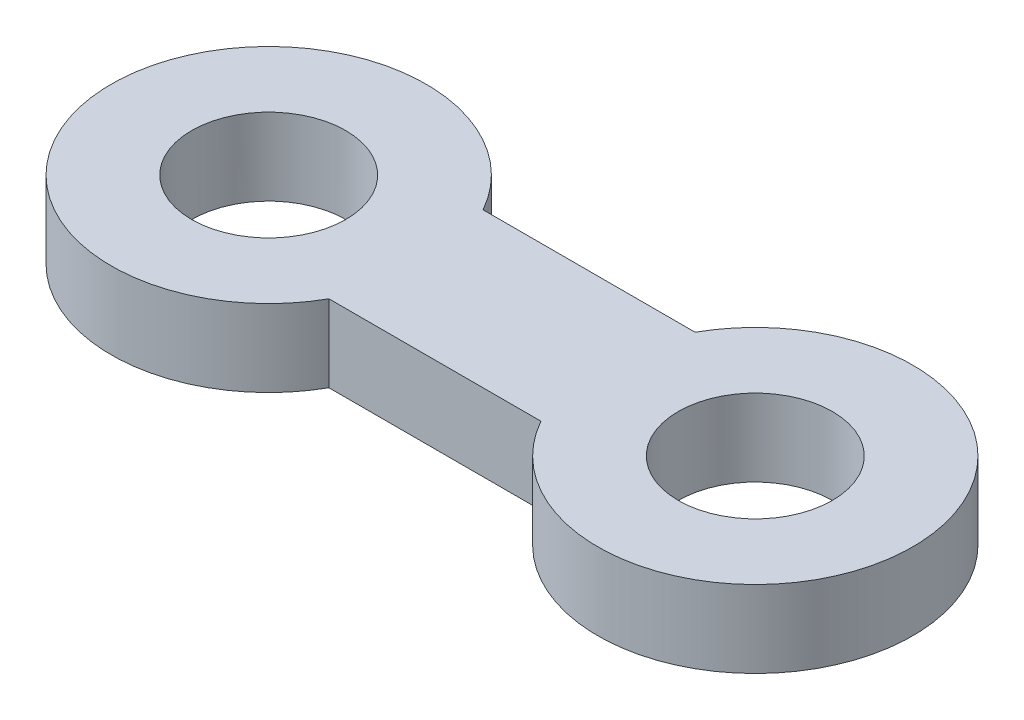
ISO-10303-21;
HEADER;
FILE_DESCRIPTION(('STEP AP214'),'2;1');
FILE_NAME('part.step','',(''),(''),'','','');
FILE_SCHEMA(('AUTOMOTIVE_DESIGN { 1 0 10303 214 1 1 1 1 }'));
ENDSEC;
DATA;
#1=APPLICATION_CONTEXT('core data for automotive mechanical design processes');
#2=APPLICATION_PROTOCOL_DEFINITION('international standard','automotive_design',2000,#1);
#3=PRODUCT_CONTEXT('',#1,'mechanical');
#4=PRODUCT('Part','Part','',(#3));
#5=PRODUCT_RELATED_PRODUCT_CATEGORY('part','',(#4));
#6=PRODUCT_DEFINITION_FORMATION('','',#4);
#7=PRODUCT_DEFINITION_CONTEXT('part definition',#1,'design');
#8=PRODUCT_DEFINITION('design','',#6,#7);
#9=PRODUCT_DEFINITION_SHAPE('','',#8);
#10=(LENGTH_UNIT() NAMED_UNIT(*) SI_UNIT(.MILLI.,.METRE.));
#11=(NAMED_UNIT(*) PLANE_ANGLE_UNIT() SI_UNIT($,.RADIAN.));
#12=(NAMED_UNIT(*) SI_UNIT($,.STERADIAN.) SOLID_ANGLE_UNIT());
#13=UNCERTAINTY_MEASURE_WITH_UNIT(LENGTH_MEASURE(1.E-05),#10,'distance_accuracy_value','');
#14=(GEOMETRIC_REPRESENTATION_CONTEXT(3) GLOBAL_UNCERTAINTY_ASSIGNED_CONTEXT((#13)) GLOBAL_UNIT_ASSIGNED_CONTEXT((#10,
#11,#12)) REPRESENTATION_CONTEXT('',''));
#15=CARTESIAN_POINT('',(0.,0.,0.));
#16=DIRECTION('',(0.,0.,1.));
#17=DIRECTION('',(1.,0.,0.));
#18=AXIS2_PLACEMENT_3D('',#15,#16,#17);
#19=CARTESIAN_POINT('',(63.1342046522275,20.,0.));
#20=DIRECTION('',(0.,-1.,0.));
#21=DIRECTION('',(0.,0.,-1.));
#22=AXIS2_PLACEMENT_3D('',#19,#20,#21);
#23=CYLINDRICAL_SURFACE('',#22,40.8631440444421);
#24=CARTESIAN_POINT('',(63.1342046522275,0.,0.));
#25=DIRECTION('',(0.,1.,0.));
#26=DIRECTION('',(0.,0.,1.));
#27=AXIS2_PLACEMENT_3D('',#24,#25,#26);
#28=CIRCLE('',#27,40.8631440444421);
#29=CARTESIAN_POINT('',(27.5,0.,-20.));
#30=VERTEX_POINT('',#29);
#31=CARTESIAN_POINT('',(27.5,0.,20.));
#32=VERTEX_POINT('',#31);
#33=EDGE_CURVE('E100',#30,#32,#28,.F.);
#34=ORIENTED_EDGE('',*,*,#33,.F.);
#35=DIRECTION('',(0.,-1.,0.));
#36=VECTOR('',#35,1.);
#37=CARTESIAN_POINT('',(27.5,20.,-20.));
#38=LINE('',#37,#36);
#39=CARTESIAN_POINT('',(27.5,20.,-20.));
#40=VERTEX_POINT('',#39);
#41=EDGE_CURVE('E60',#40,#30,#38,.T.);
#42=ORIENTED_EDGE('',*,*,#41,.F.);
#43=CARTESIAN_POINT('',(63.1342046522275,20.,0.));
#44=DIRECTION('',(0.,1.,0.));
#45=DIRECTION('',(0.,0.,1.));
#46=AXIS2_PLACEMENT_3D('',#43,#44,#45);
#47=CIRCLE('',#46,40.8631440444421);
#48=CARTESIAN_POINT('',(27.5,20.,20.));
#49=VERTEX_POINT('',#48);
#50=EDGE_CURVE('E98',#40,#49,#47,.F.);
#51=ORIENTED_EDGE('',*,*,#50,.T.);
#52=DIRECTION('',(0.,-1.,0.));
#53=VECTOR('',#52,1.);
#54=CARTESIAN_POINT('',(27.5,20.,20.));
#55=LINE('',#54,#53);
#56=EDGE_CURVE('E12',#49,#32,#55,.T.);
#57=ORIENTED_EDGE('',*,*,#56,.T.);
#58=EDGE_LOOP('',(#34,#42,#51,#57));
#59=FACE_BOUND('',#58,.T.);
#60=ADVANCED_FACE('F50',(#59),#23,.T.);
#61=CARTESIAN_POINT('',(0.,20.,-20.));
#62=DIRECTION('',(0.,0.,-1.));
#63=DIRECTION('',(-1.,0.,0.));
#64=AXIS2_PLACEMENT_3D('',#61,#62,#63);
#65=PLANE('',#64);
#66=DIRECTION('',(1.,0.,0.));
#67=VECTOR('',#66,1.);
#68=CARTESIAN_POINT('',(0.,0.,-20.));
#69=LINE('',#68,#67);
#70=CARTESIAN_POINT('',(-27.5,0.,-20.));
#71=VERTEX_POINT('',#70);
#72=EDGE_CURVE('E119',#71,#30,#69,.T.);
#73=ORIENTED_EDGE('',*,*,#72,.F.);
#74=DIRECTION('',(0.,-1.,0.));
#75=VECTOR('',#74,1.);
#76=CARTESIAN_POINT('',(-27.5,20.,-20.));
#77=LINE('',#76,#75);
#78=CARTESIAN_POINT('',(-27.5,20.,-20.));
#79=VERTEX_POINT('',#78);
#80=EDGE_CURVE('E82',#79,#71,#77,.T.);
#81=ORIENTED_EDGE('',*,*,#80,.F.);
#82=DIRECTION('',(1.,0.,0.));
#83=VECTOR('',#82,1.);
#84=CARTESIAN_POINT('',(0.,20.,-20.));
#85=LINE('',#84,#83);
#86=EDGE_CURVE('E108',#79,#40,#85,.T.);
#87=ORIENTED_EDGE('',*,*,#86,.T.);
#88=ORIENTED_EDGE('',*,*,#41,.T.);
#89=EDGE_LOOP('',(#73,#81,#87,#88));
#90=FACE_BOUND('',#89,.T.);
#91=ADVANCED_FACE('F110',(#90),#65,.T.);
#92=CARTESIAN_POINT('',(0.,20.,20.));
#93=DIRECTION('',(0.,0.,-1.));
#94=DIRECTION('',(-1.,0.,0.));
#95=AXIS2_PLACEMENT_3D('',#92,#93,#94);
#96=PLANE('',#95);
#97=DIRECTION('',(1.,0.,0.));
#98=VECTOR('',#97,1.);
#99=CARTESIAN_POINT('',(0.,0.,20.));
#100=LINE('',#99,#98);
#101=CARTESIAN_POINT('',(-27.5,0.,20.));
#102=VERTEX_POINT('',#101);
#103=EDGE_CURVE('E115',#102,#32,#100,.T.);
#104=ORIENTED_EDGE('',*,*,#103,.T.);
#105=ORIENTED_EDGE('',*,*,#56,.F.);
#106=DIRECTION('',(1.,0.,0.));
#107=VECTOR('',#106,1.);
#108=CARTESIAN_POINT('',(0.,20.,20.));
#109=LINE('',#108,#107);
#110=CARTESIAN_POINT('',(-27.5,20.,20.));
#111=VERTEX_POINT('',#110);
#112=EDGE_CURVE('E92',#111,#49,#109,.T.);
#113=ORIENTED_EDGE('',*,*,#112,.F.);
#114=DIRECTION('',(0.,-1.,0.));
#115=VECTOR('',#114,1.);
#116=CARTESIAN_POINT('',(-27.5,20.,20.));
#117=LINE('',#116,#115);
#118=EDGE_CURVE('E69',#111,#102,#117,.T.);
#119=ORIENTED_EDGE('',*,*,#118,.T.);
#120=EDGE_LOOP('',(#104,#105,#113,#119));
#121=FACE_BOUND('',#120,.T.);
#122=ADVANCED_FACE('F143',(#121),#96,.F.);
#123=CARTESIAN_POINT('',(0.,0.,0.));
#124=DIRECTION('',(0.,1.,0.));
#125=DIRECTION('',(0.,0.,1.));
#126=AXIS2_PLACEMENT_3D('',#123,#124,#125);
#127=PLANE('',#126);
#128=CARTESIAN_POINT('',(63.1342046522275,0.,0.));
#129=DIRECTION('',(0.,-1.,0.));
#130=DIRECTION('',(0.,0.,-1.));
#131=AXIS2_PLACEMENT_3D('',#128,#129,#130);
#132=CIRCLE('',#131,20.);
#133=CARTESIAN_POINT('',(63.1342046522275,0.,-20.));
#134=VERTEX_POINT('',#133);
#135=EDGE_CURVE('E121',#134,#134,#132,.T.);
#136=ORIENTED_EDGE('',*,*,#135,.F.);
#137=EDGE_LOOP('',(#136));
#138=FACE_BOUND('',#137,.T.);
#139=CARTESIAN_POINT('',(-63.1342046522275,0.,0.));
#140=DIRECTION('',(0.,-1.,0.));
#141=DIRECTION('',(0.,0.,-1.));
#142=AXIS2_PLACEMENT_3D('',#139,#140,#141);
#143=CIRCLE('',#142,20.);
#144=CARTESIAN_POINT('',(-63.1342046522275,0.,-20.));
#145=VERTEX_POINT('',#144);
#146=EDGE_CURVE('E134',#145,#145,#143,.T.);
#147=ORIENTED_EDGE('',*,*,#146,.F.);
#148=EDGE_LOOP('',(#147));
#149=FACE_BOUND('',#148,.T.);
#150=ORIENTED_EDGE('',*,*,#103,.F.);
#151=CARTESIAN_POINT('',(-63.1342046522275,0.,0.));
#152=DIRECTION('',(0.,1.,0.));
#153=DIRECTION('',(0.,0.,1.));
#154=AXIS2_PLACEMENT_3D('',#151,#152,#153);
#155=CIRCLE('',#154,40.8631440444422);
#156=EDGE_CURVE('E54',#71,#102,#155,.T.);
#157=ORIENTED_EDGE('',*,*,#156,.F.);
#158=ORIENTED_EDGE('',*,*,#72,.T.);
#159=ORIENTED_EDGE('',*,*,#33,.T.);
#160=EDGE_LOOP('',(#150,#157,#158,#159));
#161=FACE_BOUND('',#160,.T.);
#162=ADVANCED_FACE('F140',(#138,#149,#161),#127,.F.);
#163=CARTESIAN_POINT('',(0.,20.,0.));
#164=DIRECTION('',(0.,1.,0.));
#165=DIRECTION('',(0.,0.,1.));
#166=AXIS2_PLACEMENT_3D('',#163,#164,#165);
#167=PLANE('',#166);
#168=CARTESIAN_POINT('',(63.1342046522275,20.,0.));
#169=DIRECTION('',(0.,1.,0.));
#170=DIRECTION('',(0.,0.,1.));
#171=AXIS2_PLACEMENT_3D('',#168,#169,#170);
#172=CIRCLE('',#171,20.);
#173=CARTESIAN_POINT('',(63.1342046522275,20.,20.));
#174=VERTEX_POINT('',#173);
#175=EDGE_CURVE('E124',#174,#174,#172,.F.);
#176=ORIENTED_EDGE('',*,*,#175,.T.);
#177=EDGE_LOOP('',(#176));
#178=FACE_BOUND('',#177,.T.);
#179=CARTESIAN_POINT('',(-63.1342046522275,20.,0.));
#180=DIRECTION('',(0.,1.,0.));
#181=DIRECTION('',(0.,0.,1.));
#182=AXIS2_PLACEMENT_3D('',#179,#180,#181);
#183=CIRCLE('',#182,20.);
#184=CARTESIAN_POINT('',(-63.1342046522275,20.,20.));
#185=VERTEX_POINT('',#184);
#186=EDGE_CURVE('E129',#185,#185,#183,.F.);
#187=ORIENTED_EDGE('',*,*,#186,.T.);
#188=EDGE_LOOP('',(#187));
#189=FACE_BOUND('',#188,.T.);
#190=ORIENTED_EDGE('',*,*,#112,.T.);
#191=ORIENTED_EDGE('',*,*,#50,.F.);
#192=ORIENTED_EDGE('',*,*,#86,.F.);
#193=CARTESIAN_POINT('',(-63.1342046522275,20.,0.));
#194=DIRECTION('',(0.,1.,0.));
#195=DIRECTION('',(0.,0.,1.));
#196=AXIS2_PLACEMENT_3D('',#193,#194,#195);
#197=CIRCLE('',#196,40.8631440444422);
#198=EDGE_CURVE('E117',#79,#111,#197,.T.);
#199=ORIENTED_EDGE('',*,*,#198,.T.);
#200=EDGE_LOOP('',(#190,#191,#192,#199));
#201=FACE_BOUND('',#200,.T.);
#202=ADVANCED_FACE('F107',(#178,#189,#201),#167,.T.);
#203=CARTESIAN_POINT('',(-63.1342046522275,20.,0.));
#204=DIRECTION('',(0.,-1.,0.));
#205=DIRECTION('',(0.,0.,-1.));
#206=AXIS2_PLACEMENT_3D('',#203,#204,#205);
#207=CYLINDRICAL_SURFACE('',#206,40.8631440444422);
#208=ORIENTED_EDGE('',*,*,#156,.T.);
#209=ORIENTED_EDGE('',*,*,#118,.F.);
#210=ORIENTED_EDGE('',*,*,#198,.F.);
#211=ORIENTED_EDGE('',*,*,#80,.T.);
#212=EDGE_LOOP('',(#208,#209,#210,#211));
#213=FACE_BOUND('',#212,.T.);
#214=ADVANCED_FACE('F52',(#213),#207,.T.);
#215=CARTESIAN_POINT('',(-63.1342046522275,20.001,0.));
#216=DIRECTION('',(0.,-1.,0.));
#217=DIRECTION('',(0.,0.,-1.));
#218=AXIS2_PLACEMENT_3D('',#215,#216,#217);
#219=CYLINDRICAL_SURFACE('',#218,20.);
#220=ORIENTED_EDGE('',*,*,#186,.F.);
#221=EDGE_LOOP('',(#220));
#222=FACE_BOUND('',#221,.T.);
#223=ORIENTED_EDGE('',*,*,#146,.T.);
#224=EDGE_LOOP('',(#223));
#225=FACE_BOUND('',#224,.T.);
#226=ADVANCED_FACE('F138',(#222,#225),#219,.F.);
#227=CARTESIAN_POINT('',(63.1342046522275,20.001,0.));
#228=DIRECTION('',(0.,-1.,0.));
#229=DIRECTION('',(0.,0.,-1.));
#230=AXIS2_PLACEMENT_3D('',#227,#228,#229);
#231=CYLINDRICAL_SURFACE('',#230,20.);
#232=ORIENTED_EDGE('',*,*,#175,.F.);
#233=EDGE_LOOP('',(#232));
#234=FACE_BOUND('',#233,.T.);
#235=ORIENTED_EDGE('',*,*,#135,.T.);
#236=EDGE_LOOP('',(#235));
#237=FACE_BOUND('',#236,.T.);
#238=ADVANCED_FACE('F161',(#234,#237),#231,.F.);
#239=CLOSED_SHELL('',(#60,#91,#122,#162,#202,#214,#226,#238));
#240=MANIFOLD_SOLID_BREP('B2',#239);
#241=ADVANCED_BREP_SHAPE_REPRESENTATION('',(#18,#240),#14);
#242=SHAPE_DEFINITION_REPRESENTATION(#9,#241);
ENDSEC;
END-ISO-10303-21;
